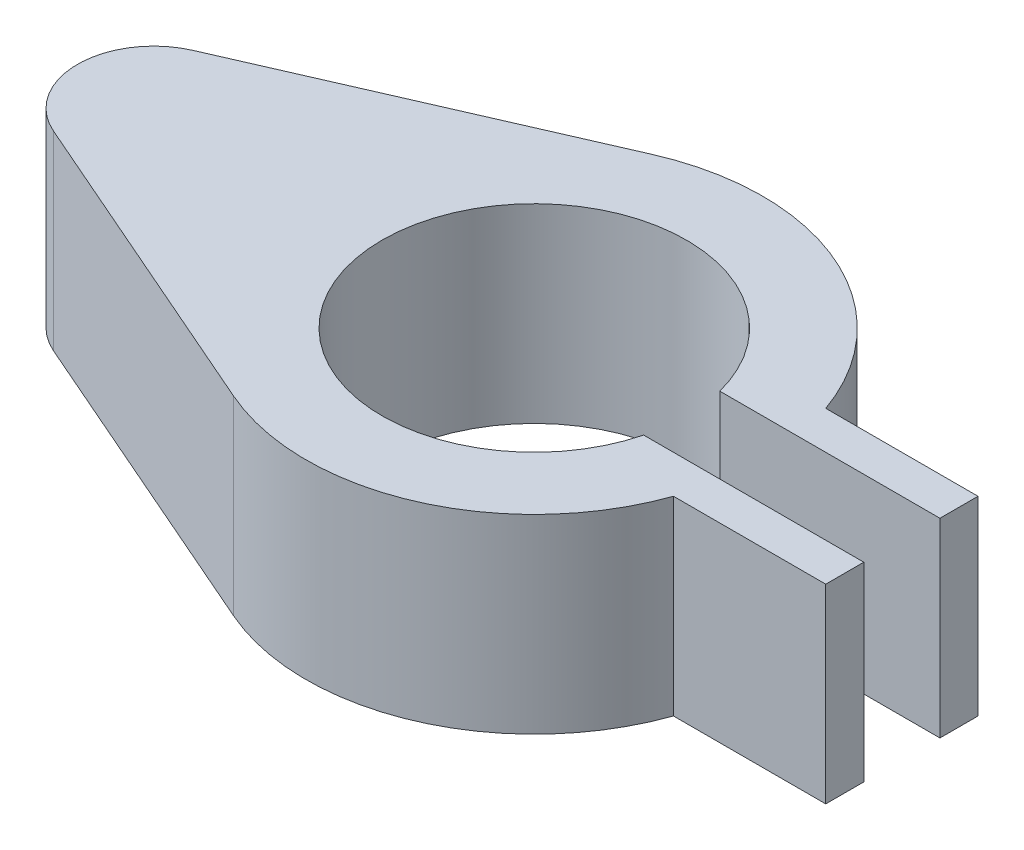
ISO-10303-21;
HEADER;
FILE_DESCRIPTION(('STEP AP214'),'2;1');
FILE_NAME('part.step','',(''),(''),'','','');
FILE_SCHEMA(('AUTOMOTIVE_DESIGN { 1 0 10303 214 1 1 1 1 }'));
ENDSEC;
DATA;
#1=APPLICATION_CONTEXT('core data for automotive mechanical design processes');
#2=APPLICATION_PROTOCOL_DEFINITION('international standard','automotive_design',2000,#1);
#3=PRODUCT_CONTEXT('',#1,'mechanical');
#4=PRODUCT('Part','Part','',(#3));
#5=PRODUCT_RELATED_PRODUCT_CATEGORY('part','',(#4));
#6=PRODUCT_DEFINITION_FORMATION('','',#4);
#7=PRODUCT_DEFINITION_CONTEXT('part definition',#1,'design');
#8=PRODUCT_DEFINITION('design','',#6,#7);
#9=PRODUCT_DEFINITION_SHAPE('','',#8);
#10=(LENGTH_UNIT() NAMED_UNIT(*) SI_UNIT(.MILLI.,.METRE.));
#11=(NAMED_UNIT(*) PLANE_ANGLE_UNIT() SI_UNIT($,.RADIAN.));
#12=(NAMED_UNIT(*) SI_UNIT($,.STERADIAN.) SOLID_ANGLE_UNIT());
#13=UNCERTAINTY_MEASURE_WITH_UNIT(LENGTH_MEASURE(1.E-05),#10,'distance_accuracy_value','');
#14=(GEOMETRIC_REPRESENTATION_CONTEXT(3) GLOBAL_UNCERTAINTY_ASSIGNED_CONTEXT((#13)) GLOBAL_UNIT_ASSIGNED_CONTEXT((#10,
#11,#12)) REPRESENTATION_CONTEXT('',''));
#15=CARTESIAN_POINT('',(0.,0.,0.));
#16=DIRECTION('',(0.,0.,1.));
#17=DIRECTION('',(1.,0.,0.));
#18=AXIS2_PLACEMENT_3D('',#15,#16,#17);
#19=CARTESIAN_POINT('',(9.65685424949238,0.,-2.));
#20=DIRECTION('',(1.,0.,0.));
#21=DIRECTION('',(0.,0.,-1.));
#22=AXIS2_PLACEMENT_3D('',#19,#20,#21);
#23=PLANE('',#22);
#24=DIRECTION('',(0.,-1.,0.));
#25=VECTOR('',#24,1.);
#26=CARTESIAN_POINT('',(9.65685424949238,0.,0.999999999999999));
#27=LINE('',#26,#25);
#28=CARTESIAN_POINT('',(9.65685424949238,5.,1.));
#29=VERTEX_POINT('',#28);
#30=CARTESIAN_POINT('',(9.65685424949238,0.,0.999999999999999));
#31=VERTEX_POINT('',#30);
#32=EDGE_CURVE('E11',#29,#31,#27,.T.);
#33=ORIENTED_EDGE('',*,*,#32,.F.);
#34=DIRECTION('',(0.,0.,-1.));
#35=VECTOR('',#34,1.);
#36=CARTESIAN_POINT('',(9.65685424949238,5.,-2.));
#37=LINE('',#36,#35);
#38=CARTESIAN_POINT('',(9.65685424949238,5.,2.));
#39=VERTEX_POINT('',#38);
#40=EDGE_CURVE('E140',#39,#29,#37,.T.);
#41=ORIENTED_EDGE('',*,*,#40,.F.);
#42=DIRECTION('',(0.,1.,0.));
#43=VECTOR('',#42,1.);
#44=CARTESIAN_POINT('',(9.65685424949238,0.,2.));
#45=LINE('',#44,#43);
#46=CARTESIAN_POINT('',(9.65685424949238,0.,2.));
#47=VERTEX_POINT('',#46);
#48=EDGE_CURVE('E157',#47,#39,#45,.T.);
#49=ORIENTED_EDGE('',*,*,#48,.F.);
#50=DIRECTION('',(0.,0.,-1.));
#51=VECTOR('',#50,1.);
#52=CARTESIAN_POINT('',(9.65685424949238,0.,-2.));
#53=LINE('',#52,#51);
#54=EDGE_CURVE('E226',#47,#31,#53,.T.);
#55=ORIENTED_EDGE('',*,*,#54,.T.);
#56=EDGE_LOOP('',(#33,#41,#49,#55));
#57=FACE_BOUND('',#56,.T.);
#58=ADVANCED_FACE('F35',(#57),#23,.T.);
#59=CARTESIAN_POINT('',(0.,5.,0.));
#60=DIRECTION('',(0.,-1.,0.));
#61=DIRECTION('',(0.,0.,-1.));
#62=AXIS2_PLACEMENT_3D('',#59,#60,#61);
#63=CYLINDRICAL_SURFACE('',#62,6.);
#64=CARTESIAN_POINT('',(0.,5.,0.));
#65=DIRECTION('',(0.,1.,0.));
#66=DIRECTION('',(0.,0.,1.));
#67=AXIS2_PLACEMENT_3D('',#64,#65,#66);
#68=CIRCLE('',#67,6.);
#69=CARTESIAN_POINT('',(5.65685424949238,5.,-2.));
#70=VERTEX_POINT('',#69);
#71=CARTESIAN_POINT('',(-2.4,5.,-5.49909083394701));
#72=VERTEX_POINT('',#71);
#73=EDGE_CURVE('E171',#70,#72,#68,.T.);
#74=ORIENTED_EDGE('',*,*,#73,.F.);
#75=DIRECTION('',(0.,1.,0.));
#76=VECTOR('',#75,1.);
#77=CARTESIAN_POINT('',(5.65685424949238,0.,-2.));
#78=LINE('',#77,#76);
#79=CARTESIAN_POINT('',(5.65685424949238,0.,-2.));
#80=VERTEX_POINT('',#79);
#81=EDGE_CURVE('E152',#80,#70,#78,.T.);
#82=ORIENTED_EDGE('',*,*,#81,.F.);
#83=CARTESIAN_POINT('',(0.,0.,0.));
#84=DIRECTION('',(0.,1.,0.));
#85=DIRECTION('',(0.,0.,1.));
#86=AXIS2_PLACEMENT_3D('',#83,#84,#85);
#87=CIRCLE('',#86,6.);
#88=CARTESIAN_POINT('',(-2.4,0.,-5.49909083394701));
#89=VERTEX_POINT('',#88);
#90=EDGE_CURVE('E183',#80,#89,#87,.T.);
#91=ORIENTED_EDGE('',*,*,#90,.T.);
#92=DIRECTION('',(0.,-1.,0.));
#93=VECTOR('',#92,1.);
#94=CARTESIAN_POINT('',(-2.4,5.,-5.49909083394701));
#95=LINE('',#94,#93);
#96=EDGE_CURVE('E176',#72,#89,#95,.T.);
#97=ORIENTED_EDGE('',*,*,#96,.F.);
#98=EDGE_LOOP('',(#74,#82,#91,#97));
#99=FACE_BOUND('',#98,.T.);
#100=ADVANCED_FACE('F223',(#99),#63,.T.);
#101=CARTESIAN_POINT('',(-2.4,5.,-5.49909083394701));
#102=DIRECTION('',(0.4,0.,0.916515138991168));
#103=DIRECTION('',(0.916515138991168,0.,-0.4));
#104=AXIS2_PLACEMENT_3D('',#101,#102,#103);
#105=PLANE('',#104);
#106=DIRECTION('',(-0.916515138991168,0.,0.4));
#107=VECTOR('',#106,1.);
#108=CARTESIAN_POINT('',(-2.4,0.,-5.49909083394701));
#109=LINE('',#108,#107);
#110=CARTESIAN_POINT('',(-10.8,0.,-1.83303027798233));
#111=VERTEX_POINT('',#110);
#112=EDGE_CURVE('E155',#89,#111,#109,.T.);
#113=ORIENTED_EDGE('',*,*,#112,.T.);
#114=DIRECTION('',(0.,-1.,0.));
#115=VECTOR('',#114,1.);
#116=CARTESIAN_POINT('',(-10.8,5.,-1.83303027798233));
#117=LINE('',#116,#115);
#118=CARTESIAN_POINT('',(-10.8,5.,-1.83303027798233));
#119=VERTEX_POINT('',#118);
#120=EDGE_CURVE('E127',#119,#111,#117,.T.);
#121=ORIENTED_EDGE('',*,*,#120,.F.);
#122=DIRECTION('',(-0.916515138991168,0.,0.4));
#123=VECTOR('',#122,1.);
#124=CARTESIAN_POINT('',(-2.4,5.,-5.49909083394701));
#125=LINE('',#124,#123);
#126=EDGE_CURVE('E163',#72,#119,#125,.T.);
#127=ORIENTED_EDGE('',*,*,#126,.F.);
#128=ORIENTED_EDGE('',*,*,#96,.T.);
#129=EDGE_LOOP('',(#113,#121,#127,#128));
#130=FACE_BOUND('',#129,.T.);
#131=ADVANCED_FACE('F37',(#130),#105,.F.);
#132=CARTESIAN_POINT('',(-10.,5.,0.));
#133=DIRECTION('',(0.,-1.,0.));
#134=DIRECTION('',(0.,0.,-1.));
#135=AXIS2_PLACEMENT_3D('',#132,#133,#134);
#136=CYLINDRICAL_SURFACE('',#135,2.);
#137=CARTESIAN_POINT('',(-10.,0.,0.));
#138=DIRECTION('',(0.,1.,0.));
#139=DIRECTION('',(0.,0.,1.));
#140=AXIS2_PLACEMENT_3D('',#137,#138,#139);
#141=CIRCLE('',#140,2.);
#142=CARTESIAN_POINT('',(-10.8,0.,1.83303027798234));
#143=VERTEX_POINT('',#142);
#144=EDGE_CURVE('E179',#111,#143,#141,.T.);
#145=ORIENTED_EDGE('',*,*,#144,.T.);
#146=DIRECTION('',(0.,-1.,0.));
#147=VECTOR('',#146,1.);
#148=CARTESIAN_POINT('',(-10.8,5.,1.83303027798234));
#149=LINE('',#148,#147);
#150=CARTESIAN_POINT('',(-10.8,5.,1.83303027798234));
#151=VERTEX_POINT('',#150);
#152=EDGE_CURVE('E194',#151,#143,#149,.T.);
#153=ORIENTED_EDGE('',*,*,#152,.F.);
#154=CARTESIAN_POINT('',(-10.,5.,0.));
#155=DIRECTION('',(0.,1.,0.));
#156=DIRECTION('',(0.,0.,1.));
#157=AXIS2_PLACEMENT_3D('',#154,#155,#156);
#158=CIRCLE('',#157,2.);
#159=EDGE_CURVE('E166',#119,#151,#158,.T.);
#160=ORIENTED_EDGE('',*,*,#159,.F.);
#161=ORIENTED_EDGE('',*,*,#120,.T.);
#162=EDGE_LOOP('',(#145,#153,#160,#161));
#163=FACE_BOUND('',#162,.T.);
#164=ADVANCED_FACE('F200',(#163),#136,.T.);
#165=CARTESIAN_POINT('',(-2.4,5.,5.49909083394701));
#166=DIRECTION('',(0.4,0.,-0.916515138991168));
#167=DIRECTION('',(-0.916515138991168,0.,-0.4));
#168=AXIS2_PLACEMENT_3D('',#165,#166,#167);
#169=PLANE('',#168);
#170=DIRECTION('',(0.916515138991168,0.,0.4));
#171=VECTOR('',#170,1.);
#172=CARTESIAN_POINT('',(-2.4,0.,5.49909083394701));
#173=LINE('',#172,#171);
#174=CARTESIAN_POINT('',(-2.4,0.,5.49909083394701));
#175=VERTEX_POINT('',#174);
#176=EDGE_CURVE('E181',#143,#175,#173,.T.);
#177=ORIENTED_EDGE('',*,*,#176,.T.);
#178=DIRECTION('',(0.,-1.,0.));
#179=VECTOR('',#178,1.);
#180=CARTESIAN_POINT('',(-2.4,5.,5.49909083394701));
#181=LINE('',#180,#179);
#182=CARTESIAN_POINT('',(-2.4,5.,5.49909083394701));
#183=VERTEX_POINT('',#182);
#184=EDGE_CURVE('E191',#183,#175,#181,.T.);
#185=ORIENTED_EDGE('',*,*,#184,.F.);
#186=DIRECTION('',(0.916515138991168,0.,0.4));
#187=VECTOR('',#186,1.);
#188=CARTESIAN_POINT('',(-2.4,5.,5.49909083394701));
#189=LINE('',#188,#187);
#190=EDGE_CURVE('E169',#151,#183,#189,.T.);
#191=ORIENTED_EDGE('',*,*,#190,.F.);
#192=ORIENTED_EDGE('',*,*,#152,.T.);
#193=EDGE_LOOP('',(#177,#185,#191,#192));
#194=FACE_BOUND('',#193,.T.);
#195=ADVANCED_FACE('F215',(#194),#169,.F.);
#196=CARTESIAN_POINT('',(5.65685424949238,0.,2.));
#197=VERTEX_POINT('',#196);
#198=EDGE_CURVE('E184',#175,#197,#87,.T.);
#199=ORIENTED_EDGE('',*,*,#198,.T.);
#200=DIRECTION('',(0.,1.,0.));
#201=VECTOR('',#200,1.);
#202=CARTESIAN_POINT('',(5.65685424949238,0.,2.));
#203=LINE('',#202,#201);
#204=CARTESIAN_POINT('',(5.65685424949238,5.,2.));
#205=VERTEX_POINT('',#204);
#206=EDGE_CURVE('E159',#197,#205,#203,.T.);
#207=ORIENTED_EDGE('',*,*,#206,.T.);
#208=EDGE_CURVE('E172',#183,#205,#68,.T.);
#209=ORIENTED_EDGE('',*,*,#208,.F.);
#210=ORIENTED_EDGE('',*,*,#184,.T.);
#211=EDGE_LOOP('',(#199,#207,#209,#210));
#212=FACE_BOUND('',#211,.T.);
#213=ADVANCED_FACE('F219',(#212),#63,.T.);
#214=CARTESIAN_POINT('',(0.,5.,0.));
#215=DIRECTION('',(0.,-1.,0.));
#216=DIRECTION('',(0.,0.,-1.));
#217=AXIS2_PLACEMENT_3D('',#214,#215,#216);
#218=CYLINDRICAL_SURFACE('',#217,4.);
#219=DIRECTION('',(0.,-1.,0.));
#220=VECTOR('',#219,1.);
#221=CARTESIAN_POINT('',(3.87298334620742,5.,1.));
#222=LINE('',#221,#220);
#223=CARTESIAN_POINT('',(3.87298334620742,0.,1.));
#224=VERTEX_POINT('',#223);
#225=CARTESIAN_POINT('',(3.87298334620742,5.,1.));
#226=VERTEX_POINT('',#225);
#227=EDGE_CURVE('E146',#224,#226,#222,.F.);
#228=ORIENTED_EDGE('',*,*,#227,.F.);
#229=CARTESIAN_POINT('',(0.,0.,0.));
#230=DIRECTION('',(0.,1.,0.));
#231=DIRECTION('',(0.,0.,1.));
#232=AXIS2_PLACEMENT_3D('',#229,#230,#231);
#233=CIRCLE('',#232,4.);
#234=CARTESIAN_POINT('',(3.87298334620742,0.,-1.));
#235=VERTEX_POINT('',#234);
#236=EDGE_CURVE('E167',#235,#224,#233,.T.);
#237=ORIENTED_EDGE('',*,*,#236,.F.);
#238=DIRECTION('',(0.,-1.,0.));
#239=VECTOR('',#238,1.);
#240=CARTESIAN_POINT('',(3.87298334620742,5.,-1.));
#241=LINE('',#240,#239);
#242=CARTESIAN_POINT('',(3.87298334620742,5.,-1.));
#243=VERTEX_POINT('',#242);
#244=EDGE_CURVE('E234',#243,#235,#241,.T.);
#245=ORIENTED_EDGE('',*,*,#244,.F.);
#246=CARTESIAN_POINT('',(0.,5.,0.));
#247=DIRECTION('',(0.,1.,0.));
#248=DIRECTION('',(0.,0.,1.));
#249=AXIS2_PLACEMENT_3D('',#246,#247,#248);
#250=CIRCLE('',#249,4.);
#251=EDGE_CURVE('E134',#243,#226,#250,.T.);
#252=ORIENTED_EDGE('',*,*,#251,.T.);
#253=EDGE_LOOP('',(#228,#237,#245,#252));
#254=FACE_BOUND('',#253,.T.);
#255=ADVANCED_FACE('F243',(#254),#218,.F.);
#256=CARTESIAN_POINT('',(0.,5.,0.));
#257=DIRECTION('',(0.,1.,0.));
#258=DIRECTION('',(0.,0.,1.));
#259=AXIS2_PLACEMENT_3D('',#256,#257,#258);
#260=PLANE('',#259);
#261=DIRECTION('',(1.,0.,0.));
#262=VECTOR('',#261,1.);
#263=CARTESIAN_POINT('',(2.32151700481377,5.,1.));
#264=LINE('',#263,#262);
#265=EDGE_CURVE('E57',#226,#29,#264,.T.);
#266=ORIENTED_EDGE('',*,*,#265,.F.);
#267=ORIENTED_EDGE('',*,*,#251,.F.);
#268=DIRECTION('',(-1.,0.,0.));
#269=VECTOR('',#268,1.);
#270=CARTESIAN_POINT('',(2.32151700481377,5.,-1.));
#271=LINE('',#270,#269);
#272=CARTESIAN_POINT('',(9.65685424949238,5.,-1.));
#273=VERTEX_POINT('',#272);
#274=EDGE_CURVE('E122',#273,#243,#271,.T.);
#275=ORIENTED_EDGE('',*,*,#274,.F.);
#276=CARTESIAN_POINT('',(9.65685424949238,5.,-2.));
#277=VERTEX_POINT('',#276);
#278=EDGE_CURVE('E131',#273,#277,#37,.T.);
#279=ORIENTED_EDGE('',*,*,#278,.T.);
#280=DIRECTION('',(-1.,0.,0.));
#281=VECTOR('',#280,1.);
#282=CARTESIAN_POINT('',(5.65685424949238,5.,-2.));
#283=LINE('',#282,#281);
#284=EDGE_CURVE('E144',#277,#70,#283,.T.);
#285=ORIENTED_EDGE('',*,*,#284,.T.);
#286=ORIENTED_EDGE('',*,*,#73,.T.);
#287=ORIENTED_EDGE('',*,*,#126,.T.);
#288=ORIENTED_EDGE('',*,*,#159,.T.);
#289=ORIENTED_EDGE('',*,*,#190,.T.);
#290=ORIENTED_EDGE('',*,*,#208,.T.);
#291=DIRECTION('',(1.,0.,0.));
#292=VECTOR('',#291,1.);
#293=CARTESIAN_POINT('',(5.65685424949238,5.,2.));
#294=LINE('',#293,#292);
#295=EDGE_CURVE('E141',#205,#39,#294,.T.);
#296=ORIENTED_EDGE('',*,*,#295,.T.);
#297=ORIENTED_EDGE('',*,*,#40,.T.);
#298=EDGE_LOOP('',(#266,#267,#275,#279,#285,#286,#287,#288,#289,#290,#296,#297));
#299=FACE_BOUND('',#298,.T.);
#300=ADVANCED_FACE('F130',(#299),#260,.T.);
#301=CARTESIAN_POINT('',(0.,0.,0.));
#302=DIRECTION('',(0.,1.,0.));
#303=DIRECTION('',(0.,0.,1.));
#304=AXIS2_PLACEMENT_3D('',#301,#302,#303);
#305=PLANE('',#304);
#306=ORIENTED_EDGE('',*,*,#236,.T.);
#307=DIRECTION('',(1.,0.,0.));
#308=VECTOR('',#307,1.);
#309=CARTESIAN_POINT('',(2.32151700481377,0.,1.));
#310=LINE('',#309,#308);
#311=EDGE_CURVE('E236',#224,#31,#310,.T.);
#312=ORIENTED_EDGE('',*,*,#311,.T.);
#313=ORIENTED_EDGE('',*,*,#54,.F.);
#314=DIRECTION('',(1.,0.,0.));
#315=VECTOR('',#314,1.);
#316=CARTESIAN_POINT('',(5.65685424949238,0.,2.));
#317=LINE('',#316,#315);
#318=EDGE_CURVE('E151',#197,#47,#317,.T.);
#319=ORIENTED_EDGE('',*,*,#318,.F.);
#320=ORIENTED_EDGE('',*,*,#198,.F.);
#321=ORIENTED_EDGE('',*,*,#176,.F.);
#322=ORIENTED_EDGE('',*,*,#144,.F.);
#323=ORIENTED_EDGE('',*,*,#112,.F.);
#324=ORIENTED_EDGE('',*,*,#90,.F.);
#325=DIRECTION('',(-1.,0.,0.));
#326=VECTOR('',#325,1.);
#327=CARTESIAN_POINT('',(5.65685424949238,0.,-2.));
#328=LINE('',#327,#326);
#329=CARTESIAN_POINT('',(9.65685424949238,0.,-2.));
#330=VERTEX_POINT('',#329);
#331=EDGE_CURVE('E162',#330,#80,#328,.T.);
#332=ORIENTED_EDGE('',*,*,#331,.F.);
#333=CARTESIAN_POINT('',(9.65685424949238,0.,-1.));
#334=VERTEX_POINT('',#333);
#335=EDGE_CURVE('E228',#334,#330,#53,.T.);
#336=ORIENTED_EDGE('',*,*,#335,.F.);
#337=DIRECTION('',(-1.,0.,0.));
#338=VECTOR('',#337,1.);
#339=CARTESIAN_POINT('',(2.32151700481377,0.,-1.));
#340=LINE('',#339,#338);
#341=EDGE_CURVE('E50',#334,#235,#340,.T.);
#342=ORIENTED_EDGE('',*,*,#341,.T.);
#343=EDGE_LOOP('',(#306,#312,#313,#319,#320,#321,#322,#323,#324,#332,#336,#342));
#344=FACE_BOUND('',#343,.T.);
#345=ADVANCED_FACE('F208',(#344),#305,.F.);
#346=CARTESIAN_POINT('',(5.65685424949238,0.,-2.));
#347=DIRECTION('',(0.,0.,-1.));
#348=DIRECTION('',(-1.,0.,0.));
#349=AXIS2_PLACEMENT_3D('',#346,#347,#348);
#350=PLANE('',#349);
#351=ORIENTED_EDGE('',*,*,#284,.F.);
#352=DIRECTION('',(0.,1.,0.));
#353=VECTOR('',#352,1.);
#354=CARTESIAN_POINT('',(9.65685424949238,0.,-2.));
#355=LINE('',#354,#353);
#356=EDGE_CURVE('E138',#330,#277,#355,.T.);
#357=ORIENTED_EDGE('',*,*,#356,.F.);
#358=ORIENTED_EDGE('',*,*,#331,.T.);
#359=ORIENTED_EDGE('',*,*,#81,.T.);
#360=EDGE_LOOP('',(#351,#357,#358,#359));
#361=FACE_BOUND('',#360,.T.);
#362=ADVANCED_FACE('F225',(#361),#350,.T.);
#363=DIRECTION('',(0.,1.,0.));
#364=VECTOR('',#363,1.);
#365=CARTESIAN_POINT('',(9.65685424949238,0.,-1.));
#366=LINE('',#365,#364);
#367=EDGE_CURVE('E43',#334,#273,#366,.T.);
#368=ORIENTED_EDGE('',*,*,#367,.F.);
#369=ORIENTED_EDGE('',*,*,#335,.T.);
#370=ORIENTED_EDGE('',*,*,#356,.T.);
#371=ORIENTED_EDGE('',*,*,#278,.F.);
#372=EDGE_LOOP('',(#368,#369,#370,#371));
#373=FACE_BOUND('',#372,.T.);
#374=ADVANCED_FACE('F136',(#373),#23,.T.);
#375=CARTESIAN_POINT('',(5.65685424949238,0.,2.));
#376=DIRECTION('',(0.,0.,1.));
#377=DIRECTION('',(1.,0.,0.));
#378=AXIS2_PLACEMENT_3D('',#375,#376,#377);
#379=PLANE('',#378);
#380=ORIENTED_EDGE('',*,*,#295,.F.);
#381=ORIENTED_EDGE('',*,*,#206,.F.);
#382=ORIENTED_EDGE('',*,*,#318,.T.);
#383=ORIENTED_EDGE('',*,*,#48,.T.);
#384=EDGE_LOOP('',(#380,#381,#382,#383));
#385=FACE_BOUND('',#384,.T.);
#386=ADVANCED_FACE('F249',(#385),#379,.T.);
#387=CARTESIAN_POINT('',(2.32151700481377,0.,-1.));
#388=DIRECTION('',(0.,0.,-1.));
#389=DIRECTION('',(-1.,0.,0.));
#390=AXIS2_PLACEMENT_3D('',#387,#388,#389);
#391=PLANE('',#390);
#392=ORIENTED_EDGE('',*,*,#244,.T.);
#393=ORIENTED_EDGE('',*,*,#341,.F.);
#394=ORIENTED_EDGE('',*,*,#367,.T.);
#395=ORIENTED_EDGE('',*,*,#274,.T.);
#396=EDGE_LOOP('',(#392,#393,#394,#395));
#397=FACE_BOUND('',#396,.T.);
#398=ADVANCED_FACE('F121',(#397),#391,.F.);
#399=CARTESIAN_POINT('',(2.32151700481377,0.,1.));
#400=DIRECTION('',(0.,0.,1.));
#401=DIRECTION('',(1.,0.,0.));
#402=AXIS2_PLACEMENT_3D('',#399,#400,#401);
#403=PLANE('',#402);
#404=ORIENTED_EDGE('',*,*,#227,.T.);
#405=ORIENTED_EDGE('',*,*,#265,.T.);
#406=ORIENTED_EDGE('',*,*,#32,.T.);
#407=ORIENTED_EDGE('',*,*,#311,.F.);
#408=EDGE_LOOP('',(#404,#405,#406,#407));
#409=FACE_BOUND('',#408,.T.);
#410=ADVANCED_FACE('F244',(#409),#403,.F.);
#411=CLOSED_SHELL('',(#58,#100,#131,#164,#195,#213,#255,#300,#345,#362,#374,#386,#398,#410));
#412=MANIFOLD_SOLID_BREP('B2',#411);
#413=ADVANCED_BREP_SHAPE_REPRESENTATION('',(#18,#412),#14);
#414=SHAPE_DEFINITION_REPRESENTATION(#9,#413);
ENDSEC;
END-ISO-10303-21;
